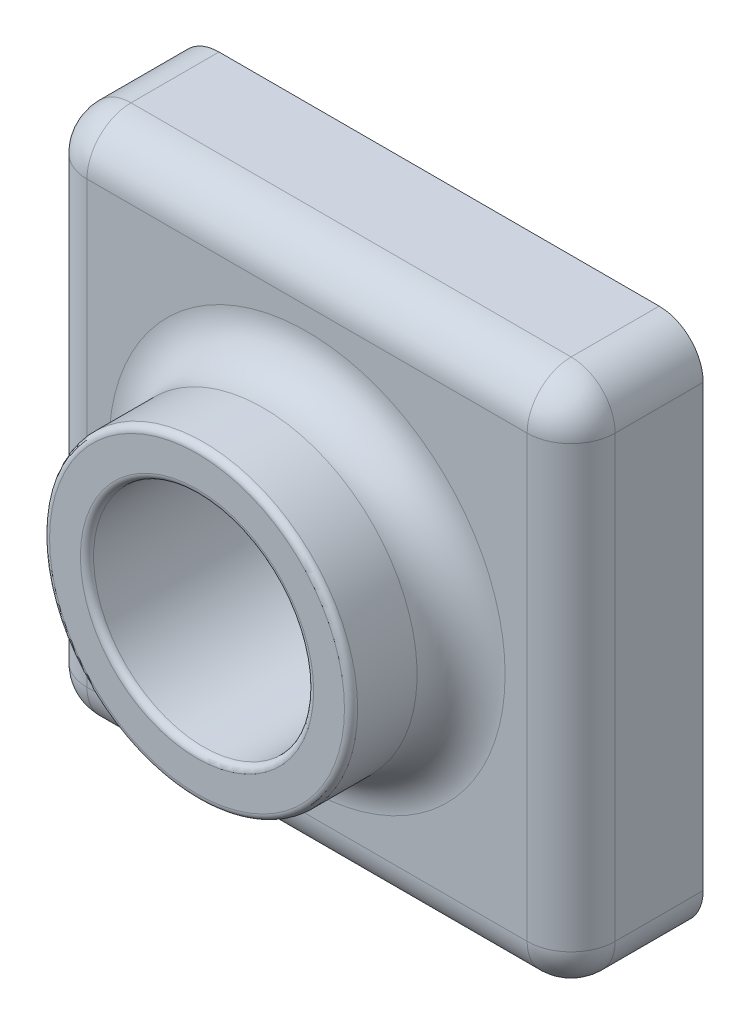
ISO-10303-21;
HEADER;
FILE_DESCRIPTION(('STEP AP214'),'2;1');
FILE_NAME('part.step','',(''),(''),'','','');
FILE_SCHEMA(('AUTOMOTIVE_DESIGN { 1 0 10303 214 1 1 1 1 }'));
ENDSEC;
DATA;
#1=APPLICATION_CONTEXT('core data for automotive mechanical design processes');
#2=APPLICATION_PROTOCOL_DEFINITION('international standard','automotive_design',2000,#1);
#3=PRODUCT_CONTEXT('',#1,'mechanical');
#4=PRODUCT('Part','Part','',(#3));
#5=PRODUCT_RELATED_PRODUCT_CATEGORY('part','',(#4));
#6=PRODUCT_DEFINITION_FORMATION('','',#4);
#7=PRODUCT_DEFINITION_CONTEXT('part definition',#1,'design');
#8=PRODUCT_DEFINITION('design','',#6,#7);
#9=PRODUCT_DEFINITION_SHAPE('','',#8);
#10=(LENGTH_UNIT() NAMED_UNIT(*) SI_UNIT(.MILLI.,.METRE.));
#11=(NAMED_UNIT(*) PLANE_ANGLE_UNIT() SI_UNIT($,.RADIAN.));
#12=(NAMED_UNIT(*) SI_UNIT($,.STERADIAN.) SOLID_ANGLE_UNIT());
#13=UNCERTAINTY_MEASURE_WITH_UNIT(LENGTH_MEASURE(1.E-05),#10,'distance_accuracy_value','');
#14=(GEOMETRIC_REPRESENTATION_CONTEXT(3) GLOBAL_UNCERTAINTY_ASSIGNED_CONTEXT((#13)) GLOBAL_UNIT_ASSIGNED_CONTEXT((#10,
#11,#12)) REPRESENTATION_CONTEXT('',''));
#15=CARTESIAN_POINT('',(0.,0.,0.));
#16=DIRECTION('',(0.,0.,1.));
#17=DIRECTION('',(1.,0.,0.));
#18=AXIS2_PLACEMENT_3D('',#15,#16,#17);
#19=CARTESIAN_POINT('',(0.,0.,0.));
#20=DIRECTION('',(0.,0.,-1.));
#21=DIRECTION('',(-1.,0.,0.));
#22=AXIS2_PLACEMENT_3D('',#19,#20,#21);
#23=PLANE('',#22);
#24=DIRECTION('',(0.,1.,0.));
#25=VECTOR('',#24,1.);
#26=CARTESIAN_POINT('',(120.,0.,0.));
#27=LINE('',#26,#25);
#28=CARTESIAN_POINT('',(120.,10.,0.));
#29=VERTEX_POINT('',#28);
#30=CARTESIAN_POINT('',(120.,110.,0.));
#31=VERTEX_POINT('',#30);
#32=EDGE_CURVE('E301',#29,#31,#27,.T.);
#33=ORIENTED_EDGE('',*,*,#32,.F.);
#34=CARTESIAN_POINT('',(110.,10.,0.));
#35=DIRECTION('',(0.,0.,-1.));
#36=DIRECTION('',(-1.,0.,0.));
#37=AXIS2_PLACEMENT_3D('',#34,#35,#36);
#38=CIRCLE('',#37,10.);
#39=CARTESIAN_POINT('',(110.,0.,0.));
#40=VERTEX_POINT('',#39);
#41=EDGE_CURVE('E352',#29,#40,#38,.T.);
#42=ORIENTED_EDGE('',*,*,#41,.T.);
#43=DIRECTION('',(1.,0.,0.));
#44=VECTOR('',#43,1.);
#45=CARTESIAN_POINT('',(0.,0.,0.));
#46=LINE('',#45,#44);
#47=CARTESIAN_POINT('',(10.,0.,0.));
#48=VERTEX_POINT('',#47);
#49=EDGE_CURVE('E298',#48,#40,#46,.T.);
#50=ORIENTED_EDGE('',*,*,#49,.F.);
#51=CARTESIAN_POINT('',(10.,10.,0.));
#52=DIRECTION('',(0.,0.,-1.));
#53=DIRECTION('',(-1.,0.,0.));
#54=AXIS2_PLACEMENT_3D('',#51,#52,#53);
#55=CIRCLE('',#54,10.);
#56=CARTESIAN_POINT('',(0.,10.,0.));
#57=VERTEX_POINT('',#56);
#58=EDGE_CURVE('E350',#48,#57,#55,.T.);
#59=ORIENTED_EDGE('',*,*,#58,.T.);
#60=DIRECTION('',(0.,-1.,0.));
#61=VECTOR('',#60,1.);
#62=CARTESIAN_POINT('',(0.,0.,0.));
#63=LINE('',#62,#61);
#64=CARTESIAN_POINT('',(0.,110.,0.));
#65=VERTEX_POINT('',#64);
#66=EDGE_CURVE('E295',#65,#57,#63,.T.);
#67=ORIENTED_EDGE('',*,*,#66,.F.);
#68=CARTESIAN_POINT('',(9.99999999999997,110.,0.));
#69=DIRECTION('',(0.,0.,-1.));
#70=DIRECTION('',(-1.,0.,0.));
#71=AXIS2_PLACEMENT_3D('',#68,#69,#70);
#72=CIRCLE('',#71,10.);
#73=CARTESIAN_POINT('',(9.99999999999997,120.,0.));
#74=VERTEX_POINT('',#73);
#75=EDGE_CURVE('E348',#65,#74,#72,.T.);
#76=ORIENTED_EDGE('',*,*,#75,.T.);
#77=DIRECTION('',(-1.,0.,0.));
#78=VECTOR('',#77,1.);
#79=CARTESIAN_POINT('',(0.,120.,0.));
#80=LINE('',#79,#78);
#81=CARTESIAN_POINT('',(110.,120.,0.));
#82=VERTEX_POINT('',#81);
#83=EDGE_CURVE('E304',#82,#74,#80,.T.);
#84=ORIENTED_EDGE('',*,*,#83,.F.);
#85=CARTESIAN_POINT('',(110.,110.,0.));
#86=DIRECTION('',(0.,0.,-1.));
#87=DIRECTION('',(-1.,0.,0.));
#88=AXIS2_PLACEMENT_3D('',#85,#86,#87);
#89=CIRCLE('',#88,10.);
#90=EDGE_CURVE('E346',#82,#31,#89,.T.);
#91=ORIENTED_EDGE('',*,*,#90,.T.);
#92=EDGE_LOOP('',(#33,#42,#50,#59,#67,#76,#84,#91));
#93=FACE_BOUND('',#92,.T.);
#94=CARTESIAN_POINT('',(110.,10.,0.));
#95=DIRECTION('',(0.,0.,-1.));
#96=DIRECTION('',(-1.,0.,0.));
#97=AXIS2_PLACEMENT_3D('',#94,#95,#96);
#98=CIRCLE('',#97,8.);
#99=CARTESIAN_POINT('',(118.,10.,0.));
#100=VERTEX_POINT('',#99);
#101=CARTESIAN_POINT('',(110.,2.,0.));
#102=VERTEX_POINT('',#101);
#103=EDGE_CURVE('E272',#100,#102,#98,.T.);
#104=ORIENTED_EDGE('',*,*,#103,.F.);
#105=DIRECTION('',(0.,1.,0.));
#106=VECTOR('',#105,1.);
#107=CARTESIAN_POINT('',(118.,0.,0.));
#108=LINE('',#107,#106);
#109=CARTESIAN_POINT('',(118.,110.,0.));
#110=VERTEX_POINT('',#109);
#111=EDGE_CURVE('E282',#100,#110,#108,.T.);
#112=ORIENTED_EDGE('',*,*,#111,.T.);
#113=CARTESIAN_POINT('',(110.,110.,0.));
#114=DIRECTION('',(0.,0.,-1.));
#115=DIRECTION('',(-1.,0.,0.));
#116=AXIS2_PLACEMENT_3D('',#113,#114,#115);
#117=CIRCLE('',#116,8.);
#118=CARTESIAN_POINT('',(110.,118.,0.));
#119=VERTEX_POINT('',#118);
#120=EDGE_CURVE('E267',#119,#110,#117,.T.);
#121=ORIENTED_EDGE('',*,*,#120,.F.);
#122=DIRECTION('',(-1.,0.,0.));
#123=VECTOR('',#122,1.);
#124=CARTESIAN_POINT('',(0.,118.,0.));
#125=LINE('',#124,#123);
#126=CARTESIAN_POINT('',(9.99999999999997,118.,0.));
#127=VERTEX_POINT('',#126);
#128=EDGE_CURVE('E48',#119,#127,#125,.T.);
#129=ORIENTED_EDGE('',*,*,#128,.T.);
#130=CARTESIAN_POINT('',(9.99999999999997,110.,0.));
#131=DIRECTION('',(0.,0.,-1.));
#132=DIRECTION('',(-1.,0.,0.));
#133=AXIS2_PLACEMENT_3D('',#130,#131,#132);
#134=CIRCLE('',#133,8.);
#135=CARTESIAN_POINT('',(1.99999999999997,110.,0.));
#136=VERTEX_POINT('',#135);
#137=EDGE_CURVE('E279',#136,#127,#134,.T.);
#138=ORIENTED_EDGE('',*,*,#137,.F.);
#139=DIRECTION('',(0.,-1.,0.));
#140=VECTOR('',#139,1.);
#141=CARTESIAN_POINT('',(2.,0.,0.));
#142=LINE('',#141,#140);
#143=CARTESIAN_POINT('',(2.,10.,0.));
#144=VERTEX_POINT('',#143);
#145=EDGE_CURVE('E276',#136,#144,#142,.T.);
#146=ORIENTED_EDGE('',*,*,#145,.T.);
#147=CARTESIAN_POINT('',(10.,10.,0.));
#148=DIRECTION('',(0.,0.,-1.));
#149=DIRECTION('',(-1.,0.,0.));
#150=AXIS2_PLACEMENT_3D('',#147,#148,#149);
#151=CIRCLE('',#150,8.);
#152=CARTESIAN_POINT('',(10.,2.,0.));
#153=VERTEX_POINT('',#152);
#154=EDGE_CURVE('E178',#153,#144,#151,.T.);
#155=ORIENTED_EDGE('',*,*,#154,.F.);
#156=DIRECTION('',(1.,0.,0.));
#157=VECTOR('',#156,1.);
#158=CARTESIAN_POINT('',(0.,2.,0.));
#159=LINE('',#158,#157);
#160=EDGE_CURVE('E278',#153,#102,#159,.T.);
#161=ORIENTED_EDGE('',*,*,#160,.T.);
#162=EDGE_LOOP('',(#104,#112,#121,#129,#138,#146,#155,#161));
#163=FACE_BOUND('',#162,.T.);
#164=ADVANCED_FACE('F33',(#93,#163),#23,.T.);
#165=CARTESIAN_POINT('',(0.,0.,30.));
#166=DIRECTION('',(1.,0.,0.));
#167=DIRECTION('',(0.,1.,0.));
#168=AXIS2_PLACEMENT_3D('',#165,#166,#167);
#169=PLANE('',#168);
#170=ORIENTED_EDGE('',*,*,#66,.T.);
#171=DIRECTION('',(0.,0.,-1.));
#172=VECTOR('',#171,1.);
#173=CARTESIAN_POINT('',(0.,10.,30.));
#174=LINE('',#173,#172);
#175=CARTESIAN_POINT('',(0.,10.,20.));
#176=VERTEX_POINT('',#175);
#177=EDGE_CURVE('E56',#57,#176,#174,.F.);
#178=ORIENTED_EDGE('',*,*,#177,.T.);
#179=DIRECTION('',(0.,-1.,0.));
#180=VECTOR('',#179,1.);
#181=CARTESIAN_POINT('',(0.,0.,20.));
#182=LINE('',#181,#180);
#183=CARTESIAN_POINT('',(0.,110.,20.));
#184=VERTEX_POINT('',#183);
#185=EDGE_CURVE('E340',#176,#184,#182,.F.);
#186=ORIENTED_EDGE('',*,*,#185,.T.);
#187=DIRECTION('',(0.,0.,-1.));
#188=VECTOR('',#187,1.);
#189=CARTESIAN_POINT('',(0.,110.,30.));
#190=LINE('',#189,#188);
#191=EDGE_CURVE('E338',#184,#65,#190,.T.);
#192=ORIENTED_EDGE('',*,*,#191,.T.);
#193=EDGE_LOOP('',(#170,#178,#186,#192));
#194=FACE_BOUND('',#193,.T.);
#195=ADVANCED_FACE('F436',(#194),#169,.F.);
#196=CARTESIAN_POINT('',(0.,0.,30.));
#197=DIRECTION('',(0.,1.,0.));
#198=DIRECTION('',(0.,0.,1.));
#199=AXIS2_PLACEMENT_3D('',#196,#197,#198);
#200=PLANE('',#199);
#201=ORIENTED_EDGE('',*,*,#49,.T.);
#202=DIRECTION('',(0.,0.,-1.));
#203=VECTOR('',#202,1.);
#204=CARTESIAN_POINT('',(110.,0.,30.));
#205=LINE('',#204,#203);
#206=CARTESIAN_POINT('',(110.,0.,20.));
#207=VERTEX_POINT('',#206);
#208=EDGE_CURVE('E336',#40,#207,#205,.F.);
#209=ORIENTED_EDGE('',*,*,#208,.T.);
#210=DIRECTION('',(1.,0.,0.));
#211=VECTOR('',#210,1.);
#212=CARTESIAN_POINT('',(0.,0.,20.));
#213=LINE('',#212,#211);
#214=CARTESIAN_POINT('',(10.,0.,20.));
#215=VERTEX_POINT('',#214);
#216=EDGE_CURVE('E334',#207,#215,#213,.F.);
#217=ORIENTED_EDGE('',*,*,#216,.T.);
#218=DIRECTION('',(0.,0.,-1.));
#219=VECTOR('',#218,1.);
#220=CARTESIAN_POINT('',(10.,0.,30.));
#221=LINE('',#220,#219);
#222=EDGE_CURVE('E332',#215,#48,#221,.T.);
#223=ORIENTED_EDGE('',*,*,#222,.T.);
#224=EDGE_LOOP('',(#201,#209,#217,#223));
#225=FACE_BOUND('',#224,.T.);
#226=ADVANCED_FACE('F441',(#225),#200,.F.);
#227=CARTESIAN_POINT('',(120.,0.,30.));
#228=DIRECTION('',(-1.,0.,0.));
#229=DIRECTION('',(0.,-1.,0.));
#230=AXIS2_PLACEMENT_3D('',#227,#228,#229);
#231=PLANE('',#230);
#232=DIRECTION('',(0.,1.,0.));
#233=VECTOR('',#232,1.);
#234=CARTESIAN_POINT('',(120.,0.,20.));
#235=LINE('',#234,#233);
#236=CARTESIAN_POINT('',(120.,110.,20.));
#237=VERTEX_POINT('',#236);
#238=CARTESIAN_POINT('',(120.,10.,20.));
#239=VERTEX_POINT('',#238);
#240=EDGE_CURVE('E328',#237,#239,#235,.F.);
#241=ORIENTED_EDGE('',*,*,#240,.T.);
#242=DIRECTION('',(0.,0.,-1.));
#243=VECTOR('',#242,1.);
#244=CARTESIAN_POINT('',(120.,10.,30.));
#245=LINE('',#244,#243);
#246=EDGE_CURVE('E330',#239,#29,#245,.T.);
#247=ORIENTED_EDGE('',*,*,#246,.T.);
#248=ORIENTED_EDGE('',*,*,#32,.T.);
#249=DIRECTION('',(0.,0.,-1.));
#250=VECTOR('',#249,1.);
#251=CARTESIAN_POINT('',(120.,110.,30.));
#252=LINE('',#251,#250);
#253=EDGE_CURVE('E326',#31,#237,#252,.F.);
#254=ORIENTED_EDGE('',*,*,#253,.T.);
#255=EDGE_LOOP('',(#241,#247,#248,#254));
#256=FACE_BOUND('',#255,.T.);
#257=ADVANCED_FACE('F818',(#256),#231,.F.);
#258=CARTESIAN_POINT('',(0.,120.,30.));
#259=DIRECTION('',(0.,-1.,0.));
#260=DIRECTION('',(0.,0.,-1.));
#261=AXIS2_PLACEMENT_3D('',#258,#259,#260);
#262=PLANE('',#261);
#263=ORIENTED_EDGE('',*,*,#83,.T.);
#264=DIRECTION('',(0.,0.,-1.));
#265=VECTOR('',#264,1.);
#266=CARTESIAN_POINT('',(9.99999999999997,120.,30.));
#267=LINE('',#266,#265);
#268=CARTESIAN_POINT('',(9.99999999999997,120.,20.));
#269=VERTEX_POINT('',#268);
#270=EDGE_CURVE('E324',#74,#269,#267,.F.);
#271=ORIENTED_EDGE('',*,*,#270,.T.);
#272=DIRECTION('',(-1.,0.,0.));
#273=VECTOR('',#272,1.);
#274=CARTESIAN_POINT('',(0.,120.,20.));
#275=LINE('',#274,#273);
#276=CARTESIAN_POINT('',(110.,120.,20.));
#277=VERTEX_POINT('',#276);
#278=EDGE_CURVE('E321',#269,#277,#275,.F.);
#279=ORIENTED_EDGE('',*,*,#278,.T.);
#280=DIRECTION('',(0.,0.,-1.));
#281=VECTOR('',#280,1.);
#282=CARTESIAN_POINT('',(110.,120.,30.));
#283=LINE('',#282,#281);
#284=EDGE_CURVE('E319',#277,#82,#283,.T.);
#285=ORIENTED_EDGE('',*,*,#284,.T.);
#286=EDGE_LOOP('',(#263,#271,#279,#285));
#287=FACE_BOUND('',#286,.T.);
#288=ADVANCED_FACE('F430',(#287),#262,.F.);
#289=CARTESIAN_POINT('',(0.,0.,30.));
#290=DIRECTION('',(0.,0.,-1.));
#291=DIRECTION('',(-1.,0.,0.));
#292=AXIS2_PLACEMENT_3D('',#289,#290,#291);
#293=PLANE('',#292);
#294=DIRECTION('',(0.,1.,0.));
#295=VECTOR('',#294,1.);
#296=CARTESIAN_POINT('',(110.,0.,30.));
#297=LINE('',#296,#295);
#298=CARTESIAN_POINT('',(110.,10.,30.));
#299=VERTEX_POINT('',#298);
#300=CARTESIAN_POINT('',(110.,110.,30.));
#301=VERTEX_POINT('',#300);
#302=EDGE_CURVE('E314',#299,#301,#297,.T.);
#303=ORIENTED_EDGE('',*,*,#302,.T.);
#304=DIRECTION('',(-1.,0.,0.));
#305=VECTOR('',#304,1.);
#306=CARTESIAN_POINT('',(0.,110.,30.));
#307=LINE('',#306,#305);
#308=CARTESIAN_POINT('',(9.99999999999997,110.,30.));
#309=VERTEX_POINT('',#308);
#310=EDGE_CURVE('E316',#301,#309,#307,.T.);
#311=ORIENTED_EDGE('',*,*,#310,.T.);
#312=DIRECTION('',(0.,-1.,0.));
#313=VECTOR('',#312,1.);
#314=CARTESIAN_POINT('',(10.,0.,30.));
#315=LINE('',#314,#313);
#316=CARTESIAN_POINT('',(10.,10.,30.));
#317=VERTEX_POINT('',#316);
#318=EDGE_CURVE('E310',#309,#317,#315,.T.);
#319=ORIENTED_EDGE('',*,*,#318,.T.);
#320=DIRECTION('',(1.,0.,0.));
#321=VECTOR('',#320,1.);
#322=CARTESIAN_POINT('',(0.,10.,30.));
#323=LINE('',#322,#321);
#324=EDGE_CURVE('E312',#317,#299,#323,.T.);
#325=ORIENTED_EDGE('',*,*,#324,.T.);
#326=EDGE_LOOP('',(#303,#311,#319,#325));
#327=FACE_BOUND('',#326,.T.);
#328=CARTESIAN_POINT('',(60.,60.,30.));
#329=DIRECTION('',(0.,0.,-1.));
#330=DIRECTION('',(-1.,0.,0.));
#331=AXIS2_PLACEMENT_3D('',#328,#329,#330);
#332=CIRCLE('',#331,45.);
#333=CARTESIAN_POINT('',(15.,60.,30.));
#334=VERTEX_POINT('',#333);
#335=EDGE_CURVE('E307',#334,#334,#332,.T.);
#336=ORIENTED_EDGE('',*,*,#335,.T.);
#337=EDGE_LOOP('',(#336));
#338=FACE_BOUND('',#337,.T.);
#339=ADVANCED_FACE('F422',(#327,#338),#293,.F.);
#340=CARTESIAN_POINT('',(60.,60.,0.));
#341=DIRECTION('',(0.,0.,-1.));
#342=DIRECTION('',(-1.,0.,0.));
#343=AXIS2_PLACEMENT_3D('',#340,#341,#342);
#344=CIRCLE('',#343,27.);
#345=CARTESIAN_POINT('',(33.,60.,0.));
#346=VERTEX_POINT('',#345);
#347=EDGE_CURVE('E223',#346,#346,#344,.F.);
#348=ORIENTED_EDGE('',*,*,#347,.F.);
#349=EDGE_LOOP('',(#348));
#350=FACE_BOUND('',#349,.T.);
#351=CARTESIAN_POINT('',(60.,60.,0.));
#352=DIRECTION('',(0.,0.,1.));
#353=DIRECTION('',(1.,0.,0.));
#354=AXIS2_PLACEMENT_3D('',#351,#352,#353);
#355=CIRCLE('',#354,25.);
#356=CARTESIAN_POINT('',(85.,60.,0.));
#357=VERTEX_POINT('',#356);
#358=EDGE_CURVE('E292',#357,#357,#355,.T.);
#359=ORIENTED_EDGE('',*,*,#358,.T.);
#360=EDGE_LOOP('',(#359));
#361=FACE_BOUND('',#360,.T.);
#362=ADVANCED_FACE('F420',(#350,#361),#23,.T.);
#363=CARTESIAN_POINT('',(60.,60.,55.));
#364=DIRECTION('',(0.,0.,-1.));
#365=DIRECTION('',(-1.,0.,0.));
#366=AXIS2_PLACEMENT_3D('',#363,#364,#365);
#367=CYLINDRICAL_SURFACE('',#366,35.);
#368=CARTESIAN_POINT('',(60.,60.,53.5));
#369=DIRECTION('',(0.,0.,1.));
#370=DIRECTION('',(1.,0.,0.));
#371=AXIS2_PLACEMENT_3D('',#368,#369,#370);
#372=CIRCLE('',#371,35.);
#373=CARTESIAN_POINT('',(95.,60.,53.5));
#374=VERTEX_POINT('',#373);
#375=EDGE_CURVE('E41',#374,#374,#372,.F.);
#376=ORIENTED_EDGE('',*,*,#375,.T.);
#377=EDGE_LOOP('',(#376));
#378=FACE_BOUND('',#377,.T.);
#379=CARTESIAN_POINT('',(60.,60.,40.));
#380=DIRECTION('',(0.,0.,-1.));
#381=DIRECTION('',(-1.,0.,0.));
#382=AXIS2_PLACEMENT_3D('',#379,#380,#381);
#383=CIRCLE('',#382,35.);
#384=CARTESIAN_POINT('',(25.,60.,40.));
#385=VERTEX_POINT('',#384);
#386=EDGE_CURVE('E343',#385,#385,#383,.F.);
#387=ORIENTED_EDGE('',*,*,#386,.T.);
#388=EDGE_LOOP('',(#387));
#389=FACE_BOUND('',#388,.T.);
#390=ADVANCED_FACE('F394',(#378,#389),#367,.T.);
#391=CARTESIAN_POINT('',(60.,60.,55.));
#392=DIRECTION('',(0.,0.,1.));
#393=DIRECTION('',(1.,0.,0.));
#394=AXIS2_PLACEMENT_3D('',#391,#392,#393);
#395=PLANE('',#394);
#396=CARTESIAN_POINT('',(60.,60.,55.));
#397=DIRECTION('',(0.,0.,1.));
#398=DIRECTION('',(1.,0.,0.));
#399=AXIS2_PLACEMENT_3D('',#396,#397,#398);
#400=CIRCLE('',#399,33.5);
#401=CARTESIAN_POINT('',(93.5,60.,55.));
#402=VERTEX_POINT('',#401);
#403=EDGE_CURVE('E389',#402,#402,#400,.T.);
#404=ORIENTED_EDGE('',*,*,#403,.T.);
#405=EDGE_LOOP('',(#404));
#406=FACE_BOUND('',#405,.T.);
#407=CARTESIAN_POINT('',(60.,60.,55.));
#408=DIRECTION('',(0.,0.,1.));
#409=DIRECTION('',(1.,0.,0.));
#410=AXIS2_PLACEMENT_3D('',#407,#408,#409);
#411=CIRCLE('',#410,26.5);
#412=CARTESIAN_POINT('',(86.5,60.,55.));
#413=VERTEX_POINT('',#412);
#414=EDGE_CURVE('E354',#413,#413,#411,.F.);
#415=ORIENTED_EDGE('',*,*,#414,.T.);
#416=EDGE_LOOP('',(#415));
#417=FACE_BOUND('',#416,.T.);
#418=ADVANCED_FACE('F403',(#406,#417),#395,.T.);
#419=CARTESIAN_POINT('',(60.,60.,0.));
#420=DIRECTION('',(0.,0.,1.));
#421=DIRECTION('',(1.,0.,0.));
#422=AXIS2_PLACEMENT_3D('',#419,#420,#421);
#423=CYLINDRICAL_SURFACE('',#422,25.);
#424=CARTESIAN_POINT('',(60.,60.,53.5));
#425=DIRECTION('',(0.,0.,1.));
#426=DIRECTION('',(1.,0.,0.));
#427=AXIS2_PLACEMENT_3D('',#424,#425,#426);
#428=CIRCLE('',#427,25.);
#429=CARTESIAN_POINT('',(85.,60.,53.5));
#430=VERTEX_POINT('',#429);
#431=EDGE_CURVE('E11',#430,#430,#428,.T.);
#432=ORIENTED_EDGE('',*,*,#431,.T.);
#433=EDGE_LOOP('',(#432));
#434=FACE_BOUND('',#433,.T.);
#435=ORIENTED_EDGE('',*,*,#358,.F.);
#436=EDGE_LOOP('',(#435));
#437=FACE_BOUND('',#436,.T.);
#438=ADVANCED_FACE('F406',(#434,#437),#423,.F.);
#439=CARTESIAN_POINT('',(110.,10.,30.));
#440=DIRECTION('',(0.,0.,-1.));
#441=DIRECTION('',(-1.,0.,0.));
#442=AXIS2_PLACEMENT_3D('',#439,#440,#441);
#443=CYLINDRICAL_SURFACE('',#442,10.);
#444=ORIENTED_EDGE('',*,*,#41,.F.);
#445=ORIENTED_EDGE('',*,*,#246,.F.);
#446=CARTESIAN_POINT('',(110.,10.,20.));
#447=DIRECTION('',(0.,0.,1.));
#448=DIRECTION('',(1.,0.,0.));
#449=AXIS2_PLACEMENT_3D('',#446,#447,#448);
#450=CIRCLE('',#449,10.);
#451=EDGE_CURVE('E296',#207,#239,#450,.T.);
#452=ORIENTED_EDGE('',*,*,#451,.F.);
#453=ORIENTED_EDGE('',*,*,#208,.F.);
#454=EDGE_LOOP('',(#444,#445,#452,#453));
#455=FACE_BOUND('',#454,.T.);
#456=ADVANCED_FACE('F416',(#455),#443,.T.);
#457=CARTESIAN_POINT('',(0.,10.,20.));
#458=DIRECTION('',(1.,0.,0.));
#459=DIRECTION('',(0.,0.,-1.));
#460=AXIS2_PLACEMENT_3D('',#457,#458,#459);
#461=CYLINDRICAL_SURFACE('',#460,10.);
#462=CARTESIAN_POINT('',(10.,10.,20.));
#463=DIRECTION('',(-1.,0.,0.));
#464=DIRECTION('',(0.,0.,1.));
#465=AXIS2_PLACEMENT_3D('',#462,#463,#464);
#466=CIRCLE('',#465,10.);
#467=EDGE_CURVE('E379',#215,#317,#466,.T.);
#468=ORIENTED_EDGE('',*,*,#467,.F.);
#469=ORIENTED_EDGE('',*,*,#216,.F.);
#470=CARTESIAN_POINT('',(110.,10.,20.));
#471=DIRECTION('',(1.,0.,0.));
#472=DIRECTION('',(0.,0.,-1.));
#473=AXIS2_PLACEMENT_3D('',#470,#471,#472);
#474=CIRCLE('',#473,10.);
#475=EDGE_CURVE('E382',#299,#207,#474,.T.);
#476=ORIENTED_EDGE('',*,*,#475,.F.);
#477=ORIENTED_EDGE('',*,*,#324,.F.);
#478=EDGE_LOOP('',(#468,#469,#476,#477));
#479=FACE_BOUND('',#478,.T.);
#480=ADVANCED_FACE('F771',(#479),#461,.T.);
#481=CARTESIAN_POINT('',(10.,10.,30.));
#482=DIRECTION('',(0.,0.,-1.));
#483=DIRECTION('',(-1.,0.,0.));
#484=AXIS2_PLACEMENT_3D('',#481,#482,#483);
#485=CYLINDRICAL_SURFACE('',#484,10.);
#486=ORIENTED_EDGE('',*,*,#58,.F.);
#487=ORIENTED_EDGE('',*,*,#222,.F.);
#488=CARTESIAN_POINT('',(10.,10.,20.));
#489=DIRECTION('',(0.,0.,1.));
#490=DIRECTION('',(1.,0.,0.));
#491=AXIS2_PLACEMENT_3D('',#488,#489,#490);
#492=CIRCLE('',#491,10.);
#493=EDGE_CURVE('E376',#176,#215,#492,.T.);
#494=ORIENTED_EDGE('',*,*,#493,.F.);
#495=ORIENTED_EDGE('',*,*,#177,.F.);
#496=EDGE_LOOP('',(#486,#487,#494,#495));
#497=FACE_BOUND('',#496,.T.);
#498=ADVANCED_FACE('F762',(#497),#485,.T.);
#499=CARTESIAN_POINT('',(110.,10.,20.));
#500=DIRECTION('',(0.,0.,1.));
#501=DIRECTION('',(1.,0.,0.));
#502=AXIS2_PLACEMENT_3D('',#499,#500,#501);
#503=SPHERICAL_SURFACE('',#502,10.);
#504=ORIENTED_EDGE('',*,*,#475,.T.);
#505=ORIENTED_EDGE('',*,*,#451,.T.);
#506=CARTESIAN_POINT('',(110.,10.,20.));
#507=DIRECTION('',(0.,-1.,0.));
#508=DIRECTION('',(1.,0.,0.));
#509=AXIS2_PLACEMENT_3D('',#506,#507,#508);
#510=CIRCLE('',#509,10.);
#511=EDGE_CURVE('E373',#299,#239,#510,.F.);
#512=ORIENTED_EDGE('',*,*,#511,.F.);
#513=EDGE_LOOP('',(#504,#505,#512));
#514=FACE_BOUND('',#513,.T.);
#515=ADVANCED_FACE('F753',(#514),#503,.T.);
#516=CARTESIAN_POINT('',(10.,10.,20.));
#517=DIRECTION('',(0.,0.,1.));
#518=DIRECTION('',(1.,0.,0.));
#519=AXIS2_PLACEMENT_3D('',#516,#517,#518);
#520=SPHERICAL_SURFACE('',#519,10.);
#521=ORIENTED_EDGE('',*,*,#493,.T.);
#522=ORIENTED_EDGE('',*,*,#467,.T.);
#523=CARTESIAN_POINT('',(10.,10.,20.));
#524=DIRECTION('',(0.,-1.,0.));
#525=DIRECTION('',(1.,0.,0.));
#526=AXIS2_PLACEMENT_3D('',#523,#524,#525);
#527=CIRCLE('',#526,10.);
#528=EDGE_CURVE('E370',#176,#317,#527,.F.);
#529=ORIENTED_EDGE('',*,*,#528,.F.);
#530=EDGE_LOOP('',(#521,#522,#529));
#531=FACE_BOUND('',#530,.T.);
#532=ADVANCED_FACE('F744',(#531),#520,.T.);
#533=CARTESIAN_POINT('',(110.,110.,30.));
#534=DIRECTION('',(0.,0.,-1.));
#535=DIRECTION('',(-1.,0.,0.));
#536=AXIS2_PLACEMENT_3D('',#533,#534,#535);
#537=CYLINDRICAL_SURFACE('',#536,10.);
#538=ORIENTED_EDGE('',*,*,#90,.F.);
#539=ORIENTED_EDGE('',*,*,#284,.F.);
#540=CARTESIAN_POINT('',(110.,110.,20.));
#541=DIRECTION('',(0.,0.,1.));
#542=DIRECTION('',(1.,0.,0.));
#543=AXIS2_PLACEMENT_3D('',#540,#541,#542);
#544=CIRCLE('',#543,10.);
#545=EDGE_CURVE('E367',#237,#277,#544,.T.);
#546=ORIENTED_EDGE('',*,*,#545,.F.);
#547=ORIENTED_EDGE('',*,*,#253,.F.);
#548=EDGE_LOOP('',(#538,#539,#546,#547));
#549=FACE_BOUND('',#548,.T.);
#550=ADVANCED_FACE('F735',(#549),#537,.T.);
#551=CARTESIAN_POINT('',(110.,0.,20.));
#552=DIRECTION('',(0.,1.,0.));
#553=DIRECTION('',(-1.,0.,0.));
#554=AXIS2_PLACEMENT_3D('',#551,#552,#553);
#555=CYLINDRICAL_SURFACE('',#554,10.);
#556=ORIENTED_EDGE('',*,*,#511,.T.);
#557=ORIENTED_EDGE('',*,*,#240,.F.);
#558=CARTESIAN_POINT('',(110.,110.,20.));
#559=DIRECTION('',(0.,1.,0.));
#560=DIRECTION('',(0.,0.,1.));
#561=AXIS2_PLACEMENT_3D('',#558,#559,#560);
#562=CIRCLE('',#561,10.);
#563=EDGE_CURVE('E364',#301,#237,#562,.T.);
#564=ORIENTED_EDGE('',*,*,#563,.F.);
#565=ORIENTED_EDGE('',*,*,#302,.F.);
#566=EDGE_LOOP('',(#556,#557,#564,#565));
#567=FACE_BOUND('',#566,.T.);
#568=ADVANCED_FACE('F726',(#567),#555,.T.);
#569=CARTESIAN_POINT('',(10.,0.,20.));
#570=DIRECTION('',(0.,-1.,0.));
#571=DIRECTION('',(1.,0.,0.));
#572=AXIS2_PLACEMENT_3D('',#569,#570,#571);
#573=CYLINDRICAL_SURFACE('',#572,10.);
#574=ORIENTED_EDGE('',*,*,#528,.T.);
#575=ORIENTED_EDGE('',*,*,#318,.F.);
#576=CARTESIAN_POINT('',(9.99999999999997,110.,20.));
#577=DIRECTION('',(0.,1.,0.));
#578=DIRECTION('',(0.,0.,1.));
#579=AXIS2_PLACEMENT_3D('',#576,#577,#578);
#580=CIRCLE('',#579,10.);
#581=EDGE_CURVE('E361',#184,#309,#580,.T.);
#582=ORIENTED_EDGE('',*,*,#581,.F.);
#583=ORIENTED_EDGE('',*,*,#185,.F.);
#584=EDGE_LOOP('',(#574,#575,#582,#583));
#585=FACE_BOUND('',#584,.T.);
#586=ADVANCED_FACE('F717',(#585),#573,.T.);
#587=CARTESIAN_POINT('',(9.99999999999997,110.,30.));
#588=DIRECTION('',(0.,0.,-1.));
#589=DIRECTION('',(-1.,0.,0.));
#590=AXIS2_PLACEMENT_3D('',#587,#588,#589);
#591=CYLINDRICAL_SURFACE('',#590,10.);
#592=ORIENTED_EDGE('',*,*,#75,.F.);
#593=ORIENTED_EDGE('',*,*,#191,.F.);
#594=CARTESIAN_POINT('',(9.99999999999997,110.,20.));
#595=DIRECTION('',(0.,0.,1.));
#596=DIRECTION('',(1.,0.,0.));
#597=AXIS2_PLACEMENT_3D('',#594,#595,#596);
#598=CIRCLE('',#597,10.);
#599=EDGE_CURVE('E358',#269,#184,#598,.T.);
#600=ORIENTED_EDGE('',*,*,#599,.F.);
#601=ORIENTED_EDGE('',*,*,#270,.F.);
#602=EDGE_LOOP('',(#592,#593,#600,#601));
#603=FACE_BOUND('',#602,.T.);
#604=ADVANCED_FACE('F708',(#603),#591,.T.);
#605=CARTESIAN_POINT('',(110.,110.,20.));
#606=DIRECTION('',(0.,0.,1.));
#607=DIRECTION('',(1.,0.,0.));
#608=AXIS2_PLACEMENT_3D('',#605,#606,#607);
#609=SPHERICAL_SURFACE('',#608,10.);
#610=ORIENTED_EDGE('',*,*,#563,.T.);
#611=ORIENTED_EDGE('',*,*,#545,.T.);
#612=CARTESIAN_POINT('',(110.,110.,20.));
#613=DIRECTION('',(1.,0.,0.));
#614=DIRECTION('',(0.,0.,-1.));
#615=AXIS2_PLACEMENT_3D('',#612,#613,#614);
#616=CIRCLE('',#615,10.);
#617=EDGE_CURVE('E356',#301,#277,#616,.F.);
#618=ORIENTED_EDGE('',*,*,#617,.F.);
#619=EDGE_LOOP('',(#610,#611,#618));
#620=FACE_BOUND('',#619,.T.);
#621=ADVANCED_FACE('F699',(#620),#609,.T.);
#622=CARTESIAN_POINT('',(9.99999999999997,110.,20.));
#623=DIRECTION('',(0.,0.,1.));
#624=DIRECTION('',(1.,0.,0.));
#625=AXIS2_PLACEMENT_3D('',#622,#623,#624);
#626=SPHERICAL_SURFACE('',#625,10.);
#627=ORIENTED_EDGE('',*,*,#599,.T.);
#628=ORIENTED_EDGE('',*,*,#581,.T.);
#629=CARTESIAN_POINT('',(9.99999999999997,110.,20.));
#630=DIRECTION('',(-1.,0.,0.));
#631=DIRECTION('',(0.,0.,1.));
#632=AXIS2_PLACEMENT_3D('',#629,#630,#631);
#633=CIRCLE('',#632,10.);
#634=EDGE_CURVE('E275',#269,#309,#633,.F.);
#635=ORIENTED_EDGE('',*,*,#634,.F.);
#636=EDGE_LOOP('',(#627,#628,#635));
#637=FACE_BOUND('',#636,.T.);
#638=ADVANCED_FACE('F690',(#637),#626,.T.);
#639=CARTESIAN_POINT('',(0.,110.,20.));
#640=DIRECTION('',(-1.,0.,0.));
#641=DIRECTION('',(0.,0.,1.));
#642=AXIS2_PLACEMENT_3D('',#639,#640,#641);
#643=CYLINDRICAL_SURFACE('',#642,10.);
#644=ORIENTED_EDGE('',*,*,#617,.T.);
#645=ORIENTED_EDGE('',*,*,#278,.F.);
#646=ORIENTED_EDGE('',*,*,#634,.T.);
#647=ORIENTED_EDGE('',*,*,#310,.F.);
#648=EDGE_LOOP('',(#644,#645,#646,#647));
#649=FACE_BOUND('',#648,.T.);
#650=ADVANCED_FACE('F680',(#649),#643,.T.);
#651=CARTESIAN_POINT('',(60.,60.,40.));
#652=DIRECTION('',(0.,0.,-1.));
#653=DIRECTION('',(-1.,0.,0.));
#654=AXIS2_PLACEMENT_3D('',#651,#652,#653);
#655=TOROIDAL_SURFACE('',#654,45.,10.);
#656=ORIENTED_EDGE('',*,*,#335,.F.);
#657=EDGE_LOOP('',(#656));
#658=FACE_BOUND('',#657,.T.);
#659=ORIENTED_EDGE('',*,*,#386,.F.);
#660=EDGE_LOOP('',(#659));
#661=FACE_BOUND('',#660,.T.);
#662=ADVANCED_FACE('F400',(#658,#661),#655,.F.);
#663=CARTESIAN_POINT('',(60.,60.,53.5));
#664=DIRECTION('',(0.,0.,1.));
#665=DIRECTION('',(1.,0.,0.));
#666=AXIS2_PLACEMENT_3D('',#663,#664,#665);
#667=TOROIDAL_SURFACE('',#666,33.5,1.5);
#668=ORIENTED_EDGE('',*,*,#375,.F.);
#669=EDGE_LOOP('',(#668));
#670=FACE_BOUND('',#669,.T.);
#671=ORIENTED_EDGE('',*,*,#403,.F.);
#672=EDGE_LOOP('',(#671));
#673=FACE_BOUND('',#672,.T.);
#674=ADVANCED_FACE('F397',(#670,#673),#667,.T.);
#675=CARTESIAN_POINT('',(60.,60.,53.5));
#676=DIRECTION('',(0.,0.,1.));
#677=DIRECTION('',(1.,0.,0.));
#678=AXIS2_PLACEMENT_3D('',#675,#676,#677);
#679=TOROIDAL_SURFACE('',#678,26.5,1.5);
#680=ORIENTED_EDGE('',*,*,#414,.F.);
#681=EDGE_LOOP('',(#680));
#682=FACE_BOUND('',#681,.T.);
#683=ORIENTED_EDGE('',*,*,#431,.F.);
#684=EDGE_LOOP('',(#683));
#685=FACE_BOUND('',#684,.T.);
#686=ADVANCED_FACE('F35',(#682,#685),#679,.T.);
#687=CARTESIAN_POINT('',(2.,0.,30.));
#688=DIRECTION('',(1.,0.,0.));
#689=DIRECTION('',(0.,1.,0.));
#690=AXIS2_PLACEMENT_3D('',#687,#688,#689);
#691=PLANE('',#690);
#692=ORIENTED_EDGE('',*,*,#145,.F.);
#693=DIRECTION('',(0.,0.,1.));
#694=VECTOR('',#693,1.);
#695=CARTESIAN_POINT('',(1.99999999999997,110.,30.));
#696=LINE('',#695,#694);
#697=CARTESIAN_POINT('',(1.99999999999997,110.,20.));
#698=VERTEX_POINT('',#697);
#699=EDGE_CURVE('E206',#698,#136,#696,.F.);
#700=ORIENTED_EDGE('',*,*,#699,.F.);
#701=DIRECTION('',(0.,1.,0.));
#702=VECTOR('',#701,1.);
#703=CARTESIAN_POINT('',(2.,0.,20.));
#704=LINE('',#703,#702);
#705=CARTESIAN_POINT('',(2.,10.,20.));
#706=VERTEX_POINT('',#705);
#707=EDGE_CURVE('E184',#706,#698,#704,.T.);
#708=ORIENTED_EDGE('',*,*,#707,.F.);
#709=DIRECTION('',(0.,0.,1.));
#710=VECTOR('',#709,1.);
#711=CARTESIAN_POINT('',(2.,10.,30.));
#712=LINE('',#711,#710);
#713=EDGE_CURVE('E173',#144,#706,#712,.T.);
#714=ORIENTED_EDGE('',*,*,#713,.F.);
#715=EDGE_LOOP('',(#692,#700,#708,#714));
#716=FACE_BOUND('',#715,.T.);
#717=ADVANCED_FACE('F205',(#716),#691,.T.);
#718=CARTESIAN_POINT('',(0.,2.,30.));
#719=DIRECTION('',(0.,1.,0.));
#720=DIRECTION('',(0.,0.,1.));
#721=AXIS2_PLACEMENT_3D('',#718,#719,#720);
#722=PLANE('',#721);
#723=ORIENTED_EDGE('',*,*,#160,.F.);
#724=DIRECTION('',(0.,0.,1.));
#725=VECTOR('',#724,1.);
#726=CARTESIAN_POINT('',(10.,2.,30.));
#727=LINE('',#726,#725);
#728=CARTESIAN_POINT('',(10.,2.,20.));
#729=VERTEX_POINT('',#728);
#730=EDGE_CURVE('E212',#729,#153,#727,.F.);
#731=ORIENTED_EDGE('',*,*,#730,.F.);
#732=DIRECTION('',(1.,0.,0.));
#733=VECTOR('',#732,1.);
#734=CARTESIAN_POINT('',(0.,2.,20.));
#735=LINE('',#734,#733);
#736=CARTESIAN_POINT('',(110.,2.,20.));
#737=VERTEX_POINT('',#736);
#738=EDGE_CURVE('E213',#737,#729,#735,.F.);
#739=ORIENTED_EDGE('',*,*,#738,.F.);
#740=DIRECTION('',(0.,0.,1.));
#741=VECTOR('',#740,1.);
#742=CARTESIAN_POINT('',(110.,2.,30.));
#743=LINE('',#742,#741);
#744=EDGE_CURVE('E209',#102,#737,#743,.T.);
#745=ORIENTED_EDGE('',*,*,#744,.F.);
#746=EDGE_LOOP('',(#723,#731,#739,#745));
#747=FACE_BOUND('',#746,.T.);
#748=ADVANCED_FACE('F456',(#747),#722,.T.);
#749=CARTESIAN_POINT('',(118.,0.,30.));
#750=DIRECTION('',(-1.,0.,0.));
#751=DIRECTION('',(0.,-1.,0.));
#752=AXIS2_PLACEMENT_3D('',#749,#750,#751);
#753=PLANE('',#752);
#754=DIRECTION('',(0.,-1.,0.));
#755=VECTOR('',#754,1.);
#756=CARTESIAN_POINT('',(118.,0.,20.));
#757=LINE('',#756,#755);
#758=CARTESIAN_POINT('',(118.,110.,20.));
#759=VERTEX_POINT('',#758);
#760=CARTESIAN_POINT('',(118.,10.,20.));
#761=VERTEX_POINT('',#760);
#762=EDGE_CURVE('E219',#759,#761,#757,.T.);
#763=ORIENTED_EDGE('',*,*,#762,.F.);
#764=DIRECTION('',(0.,0.,1.));
#765=VECTOR('',#764,1.);
#766=CARTESIAN_POINT('',(118.,110.,30.));
#767=LINE('',#766,#765);
#768=EDGE_CURVE('E226',#110,#759,#767,.T.);
#769=ORIENTED_EDGE('',*,*,#768,.F.);
#770=ORIENTED_EDGE('',*,*,#111,.F.);
#771=DIRECTION('',(0.,0.,1.));
#772=VECTOR('',#771,1.);
#773=CARTESIAN_POINT('',(118.,10.,30.));
#774=LINE('',#773,#772);
#775=EDGE_CURVE('E214',#761,#100,#774,.F.);
#776=ORIENTED_EDGE('',*,*,#775,.F.);
#777=EDGE_LOOP('',(#763,#769,#770,#776));
#778=FACE_BOUND('',#777,.T.);
#779=ADVANCED_FACE('F636',(#778),#753,.T.);
#780=CARTESIAN_POINT('',(0.,118.,30.));
#781=DIRECTION('',(0.,-1.,0.));
#782=DIRECTION('',(0.,0.,-1.));
#783=AXIS2_PLACEMENT_3D('',#780,#781,#782);
#784=PLANE('',#783);
#785=ORIENTED_EDGE('',*,*,#128,.F.);
#786=DIRECTION('',(0.,0.,-1.));
#787=VECTOR('',#786,1.);
#788=CARTESIAN_POINT('',(110.,118.,30.));
#789=LINE('',#788,#787);
#790=CARTESIAN_POINT('',(110.,118.,20.));
#791=VERTEX_POINT('',#790);
#792=EDGE_CURVE('E239',#791,#119,#789,.T.);
#793=ORIENTED_EDGE('',*,*,#792,.F.);
#794=DIRECTION('',(1.,0.,0.));
#795=VECTOR('',#794,1.);
#796=CARTESIAN_POINT('',(0.,118.,20.));
#797=LINE('',#796,#795);
#798=CARTESIAN_POINT('',(9.99999999999997,118.,20.));
#799=VERTEX_POINT('',#798);
#800=EDGE_CURVE('E254',#799,#791,#797,.T.);
#801=ORIENTED_EDGE('',*,*,#800,.F.);
#802=DIRECTION('',(0.,0.,-1.));
#803=VECTOR('',#802,1.);
#804=CARTESIAN_POINT('',(9.99999999999997,118.,30.));
#805=LINE('',#804,#803);
#806=EDGE_CURVE('E228',#127,#799,#805,.F.);
#807=ORIENTED_EDGE('',*,*,#806,.F.);
#808=EDGE_LOOP('',(#785,#793,#801,#807));
#809=FACE_BOUND('',#808,.T.);
#810=ADVANCED_FACE('F481',(#809),#784,.T.);
#811=CARTESIAN_POINT('',(0.,0.,28.));
#812=DIRECTION('',(0.,0.,-1.));
#813=DIRECTION('',(-1.,0.,0.));
#814=AXIS2_PLACEMENT_3D('',#811,#812,#813);
#815=PLANE('',#814);
#816=DIRECTION('',(0.,1.,0.));
#817=VECTOR('',#816,1.);
#818=CARTESIAN_POINT('',(110.,0.,28.));
#819=LINE('',#818,#817);
#820=CARTESIAN_POINT('',(110.,10.,28.));
#821=VERTEX_POINT('',#820);
#822=CARTESIAN_POINT('',(110.,110.,28.));
#823=VERTEX_POINT('',#822);
#824=EDGE_CURVE('E233',#821,#823,#819,.T.);
#825=ORIENTED_EDGE('',*,*,#824,.F.);
#826=DIRECTION('',(-1.,0.,0.));
#827=VECTOR('',#826,1.);
#828=CARTESIAN_POINT('',(0.,10.,28.));
#829=LINE('',#828,#827);
#830=CARTESIAN_POINT('',(10.,10.,28.));
#831=VERTEX_POINT('',#830);
#832=EDGE_CURVE('E236',#831,#821,#829,.F.);
#833=ORIENTED_EDGE('',*,*,#832,.F.);
#834=DIRECTION('',(0.,1.,0.));
#835=VECTOR('',#834,1.);
#836=CARTESIAN_POINT('',(9.99999999999997,0.,28.));
#837=LINE('',#836,#835);
#838=CARTESIAN_POINT('',(9.99999999999997,110.,28.));
#839=VERTEX_POINT('',#838);
#840=EDGE_CURVE('E201',#839,#831,#837,.F.);
#841=ORIENTED_EDGE('',*,*,#840,.F.);
#842=DIRECTION('',(-1.,0.,0.));
#843=VECTOR('',#842,1.);
#844=CARTESIAN_POINT('',(0.,110.,28.));
#845=LINE('',#844,#843);
#846=EDGE_CURVE('E235',#823,#839,#845,.T.);
#847=ORIENTED_EDGE('',*,*,#846,.F.);
#848=EDGE_LOOP('',(#825,#833,#841,#847));
#849=FACE_BOUND('',#848,.T.);
#850=CARTESIAN_POINT('',(60.,60.,28.));
#851=DIRECTION('',(0.,0.,-1.));
#852=DIRECTION('',(-1.,0.,0.));
#853=AXIS2_PLACEMENT_3D('',#850,#851,#852);
#854=CIRCLE('',#853,45.);
#855=CARTESIAN_POINT('',(15.,60.,28.));
#856=VERTEX_POINT('',#855);
#857=EDGE_CURVE('E241',#856,#856,#854,.T.);
#858=ORIENTED_EDGE('',*,*,#857,.F.);
#859=EDGE_LOOP('',(#858));
#860=FACE_BOUND('',#859,.T.);
#861=ADVANCED_FACE('F467',(#849,#860),#815,.T.);
#862=CARTESIAN_POINT('',(60.,60.,55.));
#863=DIRECTION('',(0.,0.,-1.));
#864=DIRECTION('',(-1.,0.,0.));
#865=AXIS2_PLACEMENT_3D('',#862,#863,#864);
#866=CYLINDRICAL_SURFACE('',#865,33.);
#867=CARTESIAN_POINT('',(60.,60.,53.));
#868=DIRECTION('',(0.,0.,1.));
#869=DIRECTION('',(1.,0.,0.));
#870=AXIS2_PLACEMENT_3D('',#867,#868,#869);
#871=CIRCLE('',#870,33.);
#872=CARTESIAN_POINT('',(93.,60.,53.));
#873=VERTEX_POINT('',#872);
#874=EDGE_CURVE('E268',#873,#873,#871,.T.);
#875=ORIENTED_EDGE('',*,*,#874,.T.);
#876=EDGE_LOOP('',(#875));
#877=FACE_BOUND('',#876,.T.);
#878=CARTESIAN_POINT('',(60.,60.,40.));
#879=DIRECTION('',(0.,0.,-1.));
#880=DIRECTION('',(-1.,0.,0.));
#881=AXIS2_PLACEMENT_3D('',#878,#879,#880);
#882=CIRCLE('',#881,33.);
#883=CARTESIAN_POINT('',(27.,60.,40.));
#884=VERTEX_POINT('',#883);
#885=EDGE_CURVE('E183',#884,#884,#882,.F.);
#886=ORIENTED_EDGE('',*,*,#885,.F.);
#887=EDGE_LOOP('',(#886));
#888=FACE_BOUND('',#887,.T.);
#889=ADVANCED_FACE('F510',(#877,#888),#866,.F.);
#890=CARTESIAN_POINT('',(60.,60.,53.));
#891=DIRECTION('',(0.,0.,1.));
#892=DIRECTION('',(1.,0.,0.));
#893=AXIS2_PLACEMENT_3D('',#890,#891,#892);
#894=PLANE('',#893);
#895=ORIENTED_EDGE('',*,*,#874,.F.);
#896=EDGE_LOOP('',(#895));
#897=FACE_BOUND('',#896,.T.);
#898=CARTESIAN_POINT('',(60.,60.,53.));
#899=DIRECTION('',(0.,0.,1.));
#900=DIRECTION('',(1.,0.,0.));
#901=AXIS2_PLACEMENT_3D('',#898,#899,#900);
#902=CIRCLE('',#901,27.);
#903=CARTESIAN_POINT('',(87.,60.,53.));
#904=VERTEX_POINT('',#903);
#905=EDGE_CURVE('E271',#904,#904,#902,.T.);
#906=ORIENTED_EDGE('',*,*,#905,.T.);
#907=EDGE_LOOP('',(#906));
#908=FACE_BOUND('',#907,.T.);
#909=ADVANCED_FACE('F512',(#897,#908),#894,.F.);
#910=CARTESIAN_POINT('',(60.,60.,0.));
#911=DIRECTION('',(0.,0.,1.));
#912=DIRECTION('',(1.,0.,0.));
#913=AXIS2_PLACEMENT_3D('',#910,#911,#912);
#914=CYLINDRICAL_SURFACE('',#913,27.);
#915=ORIENTED_EDGE('',*,*,#905,.F.);
#916=EDGE_LOOP('',(#915));
#917=FACE_BOUND('',#916,.T.);
#918=ORIENTED_EDGE('',*,*,#347,.T.);
#919=EDGE_LOOP('',(#918));
#920=FACE_BOUND('',#919,.T.);
#921=ADVANCED_FACE('F519',(#917,#920),#914,.T.);
#922=CARTESIAN_POINT('',(110.,10.,30.));
#923=DIRECTION('',(0.,0.,-1.));
#924=DIRECTION('',(-1.,0.,0.));
#925=AXIS2_PLACEMENT_3D('',#922,#923,#924);
#926=CYLINDRICAL_SURFACE('',#925,8.);
#927=ORIENTED_EDGE('',*,*,#103,.T.);
#928=ORIENTED_EDGE('',*,*,#744,.T.);
#929=CARTESIAN_POINT('',(110.,10.,20.));
#930=DIRECTION('',(0.,0.,1.));
#931=DIRECTION('',(1.,0.,0.));
#932=AXIS2_PLACEMENT_3D('',#929,#930,#931);
#933=CIRCLE('',#932,8.);
#934=EDGE_CURVE('E220',#737,#761,#933,.T.);
#935=ORIENTED_EDGE('',*,*,#934,.T.);
#936=ORIENTED_EDGE('',*,*,#775,.T.);
#937=EDGE_LOOP('',(#927,#928,#935,#936));
#938=FACE_BOUND('',#937,.T.);
#939=ADVANCED_FACE('F452',(#938),#926,.F.);
#940=CARTESIAN_POINT('',(0.,10.,20.));
#941=DIRECTION('',(1.,0.,0.));
#942=DIRECTION('',(0.,0.,-1.));
#943=AXIS2_PLACEMENT_3D('',#940,#941,#942);
#944=CYLINDRICAL_SURFACE('',#943,8.);
#945=CARTESIAN_POINT('',(10.,10.,20.));
#946=DIRECTION('',(-1.,0.,0.));
#947=DIRECTION('',(0.,-1.,0.));
#948=AXIS2_PLACEMENT_3D('',#945,#946,#947);
#949=CIRCLE('',#948,8.);
#950=EDGE_CURVE('E193',#729,#831,#949,.T.);
#951=ORIENTED_EDGE('',*,*,#950,.T.);
#952=ORIENTED_EDGE('',*,*,#832,.T.);
#953=CARTESIAN_POINT('',(110.,10.,20.));
#954=DIRECTION('',(-1.,0.,0.));
#955=DIRECTION('',(0.,-1.,0.));
#956=AXIS2_PLACEMENT_3D('',#953,#954,#955);
#957=CIRCLE('',#956,8.);
#958=EDGE_CURVE('E224',#821,#737,#957,.F.);
#959=ORIENTED_EDGE('',*,*,#958,.T.);
#960=ORIENTED_EDGE('',*,*,#738,.T.);
#961=EDGE_LOOP('',(#951,#952,#959,#960));
#962=FACE_BOUND('',#961,.T.);
#963=ADVANCED_FACE('F464',(#962),#944,.F.);
#964=CARTESIAN_POINT('',(10.,10.,30.));
#965=DIRECTION('',(0.,0.,-1.));
#966=DIRECTION('',(-1.,0.,0.));
#967=AXIS2_PLACEMENT_3D('',#964,#965,#966);
#968=CYLINDRICAL_SURFACE('',#967,8.);
#969=ORIENTED_EDGE('',*,*,#154,.T.);
#970=ORIENTED_EDGE('',*,*,#713,.T.);
#971=CARTESIAN_POINT('',(10.,10.,20.));
#972=DIRECTION('',(0.,0.,1.));
#973=DIRECTION('',(1.,0.,0.));
#974=AXIS2_PLACEMENT_3D('',#971,#972,#973);
#975=CIRCLE('',#974,8.);
#976=EDGE_CURVE('E176',#706,#729,#975,.T.);
#977=ORIENTED_EDGE('',*,*,#976,.T.);
#978=ORIENTED_EDGE('',*,*,#730,.T.);
#979=EDGE_LOOP('',(#969,#970,#977,#978));
#980=FACE_BOUND('',#979,.T.);
#981=ADVANCED_FACE('F175',(#980),#968,.F.);
#982=CARTESIAN_POINT('',(110.,10.,20.));
#983=DIRECTION('',(0.,0.,1.));
#984=DIRECTION('',(1.,0.,0.));
#985=AXIS2_PLACEMENT_3D('',#982,#983,#984);
#986=SPHERICAL_SURFACE('',#985,8.);
#987=ORIENTED_EDGE('',*,*,#958,.F.);
#988=CARTESIAN_POINT('',(110.,10.,20.));
#989=DIRECTION('',(0.,1.,0.));
#990=DIRECTION('',(-1.,0.,0.));
#991=AXIS2_PLACEMENT_3D('',#988,#989,#990);
#992=CIRCLE('',#991,8.);
#993=EDGE_CURVE('E194',#821,#761,#992,.T.);
#994=ORIENTED_EDGE('',*,*,#993,.T.);
#995=ORIENTED_EDGE('',*,*,#934,.F.);
#996=EDGE_LOOP('',(#987,#994,#995));
#997=FACE_BOUND('',#996,.T.);
#998=ADVANCED_FACE('F462',(#997),#986,.F.);
#999=CARTESIAN_POINT('',(10.,10.,20.));
#1000=DIRECTION('',(0.,0.,1.));
#1001=DIRECTION('',(1.,0.,0.));
#1002=AXIS2_PLACEMENT_3D('',#999,#1000,#1001);
#1003=SPHERICAL_SURFACE('',#1002,8.);
#1004=ORIENTED_EDGE('',*,*,#976,.F.);
#1005=CARTESIAN_POINT('',(10.,10.,20.));
#1006=DIRECTION('',(0.,-1.,0.));
#1007=DIRECTION('',(1.,0.,0.));
#1008=AXIS2_PLACEMENT_3D('',#1005,#1006,#1007);
#1009=CIRCLE('',#1008,8.);
#1010=EDGE_CURVE('E191',#706,#831,#1009,.F.);
#1011=ORIENTED_EDGE('',*,*,#1010,.T.);
#1012=ORIENTED_EDGE('',*,*,#950,.F.);
#1013=EDGE_LOOP('',(#1004,#1011,#1012));
#1014=FACE_BOUND('',#1013,.T.);
#1015=ADVANCED_FACE('F190',(#1014),#1003,.F.);
#1016=CARTESIAN_POINT('',(110.,110.,30.));
#1017=DIRECTION('',(0.,0.,-1.));
#1018=DIRECTION('',(-1.,0.,0.));
#1019=AXIS2_PLACEMENT_3D('',#1016,#1017,#1018);
#1020=CYLINDRICAL_SURFACE('',#1019,8.);
#1021=ORIENTED_EDGE('',*,*,#120,.T.);
#1022=ORIENTED_EDGE('',*,*,#768,.T.);
#1023=CARTESIAN_POINT('',(110.,110.,20.));
#1024=DIRECTION('',(0.,0.,1.));
#1025=DIRECTION('',(1.,0.,0.));
#1026=AXIS2_PLACEMENT_3D('',#1023,#1024,#1025);
#1027=CIRCLE('',#1026,8.);
#1028=EDGE_CURVE('E203',#759,#791,#1027,.T.);
#1029=ORIENTED_EDGE('',*,*,#1028,.T.);
#1030=ORIENTED_EDGE('',*,*,#792,.T.);
#1031=EDGE_LOOP('',(#1021,#1022,#1029,#1030));
#1032=FACE_BOUND('',#1031,.T.);
#1033=ADVANCED_FACE('F483',(#1032),#1020,.F.);
#1034=CARTESIAN_POINT('',(110.,0.,20.));
#1035=DIRECTION('',(0.,1.,0.));
#1036=DIRECTION('',(-1.,0.,0.));
#1037=AXIS2_PLACEMENT_3D('',#1034,#1035,#1036);
#1038=CYLINDRICAL_SURFACE('',#1037,8.);
#1039=ORIENTED_EDGE('',*,*,#993,.F.);
#1040=ORIENTED_EDGE('',*,*,#824,.T.);
#1041=CARTESIAN_POINT('',(110.,110.,20.));
#1042=DIRECTION('',(0.,-1.,0.));
#1043=DIRECTION('',(0.,0.,-1.));
#1044=AXIS2_PLACEMENT_3D('',#1041,#1042,#1043);
#1045=CIRCLE('',#1044,8.);
#1046=EDGE_CURVE('E248',#823,#759,#1045,.F.);
#1047=ORIENTED_EDGE('',*,*,#1046,.T.);
#1048=ORIENTED_EDGE('',*,*,#762,.T.);
#1049=EDGE_LOOP('',(#1039,#1040,#1047,#1048));
#1050=FACE_BOUND('',#1049,.T.);
#1051=ADVANCED_FACE('F472',(#1050),#1038,.F.);
#1052=CARTESIAN_POINT('',(10.,0.,20.));
#1053=DIRECTION('',(0.,-1.,0.));
#1054=DIRECTION('',(1.,0.,0.));
#1055=AXIS2_PLACEMENT_3D('',#1052,#1053,#1054);
#1056=CYLINDRICAL_SURFACE('',#1055,8.);
#1057=ORIENTED_EDGE('',*,*,#1010,.F.);
#1058=ORIENTED_EDGE('',*,*,#707,.T.);
#1059=CARTESIAN_POINT('',(9.99999999999997,110.,20.));
#1060=DIRECTION('',(0.,1.,0.));
#1061=DIRECTION('',(-1.,0.,0.));
#1062=AXIS2_PLACEMENT_3D('',#1059,#1060,#1061);
#1063=CIRCLE('',#1062,8.);
#1064=EDGE_CURVE('E246',#698,#839,#1063,.T.);
#1065=ORIENTED_EDGE('',*,*,#1064,.T.);
#1066=ORIENTED_EDGE('',*,*,#840,.T.);
#1067=EDGE_LOOP('',(#1057,#1058,#1065,#1066));
#1068=FACE_BOUND('',#1067,.T.);
#1069=ADVANCED_FACE('F197',(#1068),#1056,.F.);
#1070=CARTESIAN_POINT('',(9.99999999999997,110.,30.));
#1071=DIRECTION('',(0.,0.,-1.));
#1072=DIRECTION('',(-1.,0.,0.));
#1073=AXIS2_PLACEMENT_3D('',#1070,#1071,#1072);
#1074=CYLINDRICAL_SURFACE('',#1073,8.);
#1075=ORIENTED_EDGE('',*,*,#137,.T.);
#1076=ORIENTED_EDGE('',*,*,#806,.T.);
#1077=CARTESIAN_POINT('',(9.99999999999997,110.,20.));
#1078=DIRECTION('',(0.,0.,1.));
#1079=DIRECTION('',(1.,0.,0.));
#1080=AXIS2_PLACEMENT_3D('',#1077,#1078,#1079);
#1081=CIRCLE('',#1080,8.);
#1082=EDGE_CURVE('E249',#799,#698,#1081,.T.);
#1083=ORIENTED_EDGE('',*,*,#1082,.T.);
#1084=ORIENTED_EDGE('',*,*,#699,.T.);
#1085=EDGE_LOOP('',(#1075,#1076,#1083,#1084));
#1086=FACE_BOUND('',#1085,.T.);
#1087=ADVANCED_FACE('F487',(#1086),#1074,.F.);
#1088=CARTESIAN_POINT('',(110.,110.,20.));
#1089=DIRECTION('',(0.,0.,1.));
#1090=DIRECTION('',(1.,0.,0.));
#1091=AXIS2_PLACEMENT_3D('',#1088,#1089,#1090);
#1092=SPHERICAL_SURFACE('',#1091,8.);
#1093=ORIENTED_EDGE('',*,*,#1046,.F.);
#1094=CARTESIAN_POINT('',(110.,110.,20.));
#1095=DIRECTION('',(-1.,0.,0.));
#1096=DIRECTION('',(0.,0.,1.));
#1097=AXIS2_PLACEMENT_3D('',#1094,#1095,#1096);
#1098=CIRCLE('',#1097,8.);
#1099=EDGE_CURVE('E252',#823,#791,#1098,.T.);
#1100=ORIENTED_EDGE('',*,*,#1099,.T.);
#1101=ORIENTED_EDGE('',*,*,#1028,.F.);
#1102=EDGE_LOOP('',(#1093,#1100,#1101));
#1103=FACE_BOUND('',#1102,.T.);
#1104=ADVANCED_FACE('F476',(#1103),#1092,.F.);
#1105=CARTESIAN_POINT('',(9.99999999999997,110.,20.));
#1106=DIRECTION('',(0.,0.,1.));
#1107=DIRECTION('',(1.,0.,0.));
#1108=AXIS2_PLACEMENT_3D('',#1105,#1106,#1107);
#1109=SPHERICAL_SURFACE('',#1108,8.);
#1110=ORIENTED_EDGE('',*,*,#1082,.F.);
#1111=CARTESIAN_POINT('',(9.99999999999997,110.,20.));
#1112=DIRECTION('',(-1.,0.,0.));
#1113=DIRECTION('',(0.,0.,1.));
#1114=AXIS2_PLACEMENT_3D('',#1111,#1112,#1113);
#1115=CIRCLE('',#1114,8.);
#1116=EDGE_CURVE('E263',#799,#839,#1115,.F.);
#1117=ORIENTED_EDGE('',*,*,#1116,.T.);
#1118=ORIENTED_EDGE('',*,*,#1064,.F.);
#1119=EDGE_LOOP('',(#1110,#1117,#1118));
#1120=FACE_BOUND('',#1119,.T.);
#1121=ADVANCED_FACE('F490',(#1120),#1109,.F.);
#1122=CARTESIAN_POINT('',(0.,110.,20.));
#1123=DIRECTION('',(-1.,0.,0.));
#1124=DIRECTION('',(0.,0.,1.));
#1125=AXIS2_PLACEMENT_3D('',#1122,#1123,#1124);
#1126=CYLINDRICAL_SURFACE('',#1125,8.);
#1127=ORIENTED_EDGE('',*,*,#1099,.F.);
#1128=ORIENTED_EDGE('',*,*,#846,.T.);
#1129=ORIENTED_EDGE('',*,*,#1116,.F.);
#1130=ORIENTED_EDGE('',*,*,#800,.T.);
#1131=EDGE_LOOP('',(#1127,#1128,#1129,#1130));
#1132=FACE_BOUND('',#1131,.T.);
#1133=ADVANCED_FACE('F478',(#1132),#1126,.F.);
#1134=CARTESIAN_POINT('',(60.,60.,40.));
#1135=DIRECTION('',(0.,0.,-1.));
#1136=DIRECTION('',(-1.,0.,0.));
#1137=AXIS2_PLACEMENT_3D('',#1134,#1135,#1136);
#1138=TOROIDAL_SURFACE('',#1137,45.,12.);
#1139=ORIENTED_EDGE('',*,*,#857,.T.);
#1140=EDGE_LOOP('',(#1139));
#1141=FACE_BOUND('',#1140,.T.);
#1142=ORIENTED_EDGE('',*,*,#885,.T.);
#1143=EDGE_LOOP('',(#1142));
#1144=FACE_BOUND('',#1143,.T.);
#1145=ADVANCED_FACE('F497',(#1141,#1144),#1138,.T.);
#1146=CLOSED_SHELL('',(#164,#195,#226,#257,#288,#339,#362,#390,#418,#438,#456,#480,#498,#515,
#532,#550,#568,#586,#604,#621,#638,#650,#662,#674,#686,#717,#748,#779,#810,#861,#889,#909,#921,
#939,#963,#981,#998,#1015,#1033,#1051,#1069,#1087,#1104,#1121,#1133,#1145));
#1147=MANIFOLD_SOLID_BREP('B2',#1146);
#1148=ADVANCED_BREP_SHAPE_REPRESENTATION('',(#18,#1147),#14);
#1149=SHAPE_DEFINITION_REPRESENTATION(#9,#1148);
ENDSEC;
END-ISO-10303-21;
